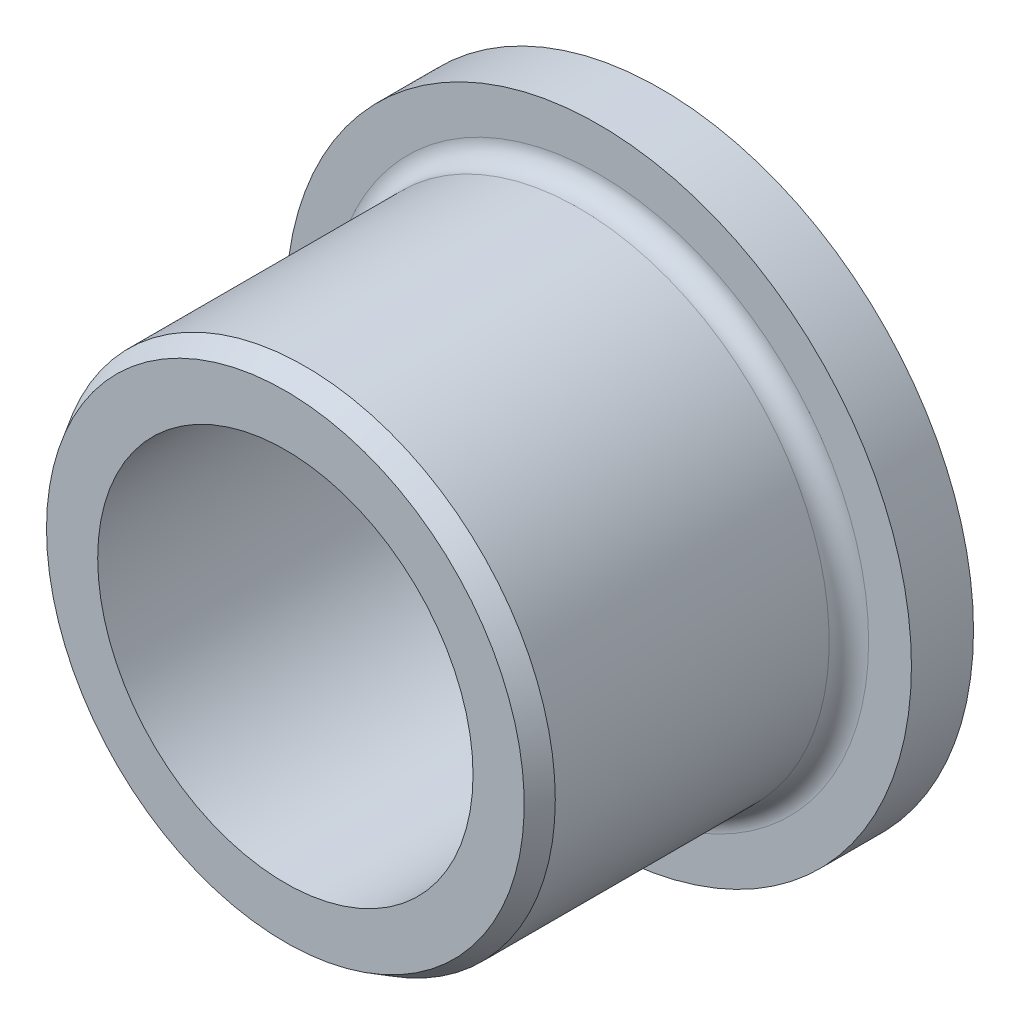
ISO-10303-21;
HEADER;
FILE_DESCRIPTION(('STEP AP214'),'2;1');
FILE_NAME('part.step','',(''),(''),'','','');
FILE_SCHEMA(('AUTOMOTIVE_DESIGN { 1 0 10303 214 1 1 1 1 }'));
ENDSEC;
DATA;
#1=APPLICATION_CONTEXT('core data for automotive mechanical design processes');
#2=APPLICATION_PROTOCOL_DEFINITION('international standard','automotive_design',2000,#1);
#3=PRODUCT_CONTEXT('',#1,'mechanical');
#4=PRODUCT('Part','Part','',(#3));
#5=PRODUCT_RELATED_PRODUCT_CATEGORY('part','',(#4));
#6=PRODUCT_DEFINITION_FORMATION('','',#4);
#7=PRODUCT_DEFINITION_CONTEXT('part definition',#1,'design');
#8=PRODUCT_DEFINITION('design','',#6,#7);
#9=PRODUCT_DEFINITION_SHAPE('','',#8);
#10=(LENGTH_UNIT() NAMED_UNIT(*) SI_UNIT(.MILLI.,.METRE.));
#11=(NAMED_UNIT(*) PLANE_ANGLE_UNIT() SI_UNIT($,.RADIAN.));
#12=(NAMED_UNIT(*) SI_UNIT($,.STERADIAN.) SOLID_ANGLE_UNIT());
#13=UNCERTAINTY_MEASURE_WITH_UNIT(LENGTH_MEASURE(1.E-05),#10,'distance_accuracy_value','');
#14=(GEOMETRIC_REPRESENTATION_CONTEXT(3) GLOBAL_UNCERTAINTY_ASSIGNED_CONTEXT((#13)) GLOBAL_UNIT_ASSIGNED_CONTEXT((#10,
#11,#12)) REPRESENTATION_CONTEXT('',''));
#15=CARTESIAN_POINT('',(0.,0.,0.));
#16=DIRECTION('',(0.,0.,1.));
#17=DIRECTION('',(1.,0.,0.));
#18=AXIS2_PLACEMENT_3D('',#15,#16,#17);
#19=CARTESIAN_POINT('',(0.,0.,2.07480000000003));
#20=DIRECTION('',(0.,0.,1.));
#21=DIRECTION('',(1.,0.,0.));
#22=AXIS2_PLACEMENT_3D('',#19,#20,#21);
#23=TOROIDAL_SURFACE('',#22,6.85000000000054,0.500000000000032);
#24=CARTESIAN_POINT('',(0.,0.,1.5748));
#25=DIRECTION('',(0.,0.,1.));
#26=DIRECTION('',(1.,0.,0.));
#27=AXIS2_PLACEMENT_3D('',#24,#25,#26);
#28=CIRCLE('',#27,6.85000000000054);
#29=CARTESIAN_POINT('',(-6.85000000000054,0.,1.5748));
#30=VERTEX_POINT('',#29);
#31=CARTESIAN_POINT('',(6.85000000000054,0.,1.5748));
#32=VERTEX_POINT('',#31);
#33=EDGE_CURVE('E38',#30,#32,#28,.F.);
#34=ORIENTED_EDGE('',*,*,#33,.F.);
#35=CARTESIAN_POINT('',(0.,0.,1.5748));
#36=DIRECTION('',(0.,0.,1.));
#37=DIRECTION('',(-1.,0.,0.));
#38=AXIS2_PLACEMENT_3D('',#35,#36,#37);
#39=CIRCLE('',#38,6.85000000000054);
#40=EDGE_CURVE('E35',#32,#30,#39,.F.);
#41=ORIENTED_EDGE('',*,*,#40,.F.);
#42=EDGE_LOOP('',(#34,#41));
#43=FACE_BOUND('',#42,.T.);
#44=CARTESIAN_POINT('',(0.,0.,2.07480000000003));
#45=DIRECTION('',(0.,0.,-1.));
#46=DIRECTION('',(-1.,0.,0.));
#47=AXIS2_PLACEMENT_3D('',#44,#45,#46);
#48=CIRCLE('',#47,6.35);
#49=CARTESIAN_POINT('',(-6.35,0.,2.07480000000003));
#50=VERTEX_POINT('',#49);
#51=EDGE_CURVE('E44',#50,#50,#48,.F.);
#52=ORIENTED_EDGE('',*,*,#51,.F.);
#53=EDGE_LOOP('',(#52));
#54=FACE_BOUND('',#53,.T.);
#55=ADVANCED_FACE('F17',(#43,#54),#23,.F.);
#56=CARTESIAN_POINT('',(7.393749999999,0.,1.5748));
#57=DIRECTION('',(0.,0.,1.));
#58=DIRECTION('',(1.,0.,0.));
#59=AXIS2_PLACEMENT_3D('',#56,#57,#58);
#60=PLANE('',#59);
#61=ORIENTED_EDGE('',*,*,#40,.T.);
#62=ORIENTED_EDGE('',*,*,#33,.T.);
#63=EDGE_LOOP('',(#61,#62));
#64=FACE_BOUND('',#63,.T.);
#65=CARTESIAN_POINT('',(0.,0.,1.5748));
#66=DIRECTION('',(0.,0.,-1.));
#67=DIRECTION('',(-1.,0.,0.));
#68=AXIS2_PLACEMENT_3D('',#65,#66,#67);
#69=CIRCLE('',#68,7.9375);
#70=CARTESIAN_POINT('',(-7.9375,0.,1.5748));
#71=VERTEX_POINT('',#70);
#72=EDGE_CURVE('E49',#71,#71,#69,.T.);
#73=ORIENTED_EDGE('',*,*,#72,.F.);
#74=EDGE_LOOP('',(#73));
#75=FACE_BOUND('',#74,.T.);
#76=ADVANCED_FACE('F40',(#64,#75),#60,.T.);
#77=CARTESIAN_POINT('',(0.,0.,5.5499));
#78=DIRECTION('',(0.,0.,-1.));
#79=DIRECTION('',(-1.,0.,0.));
#80=AXIS2_PLACEMENT_3D('',#77,#78,#79);
#81=CYLINDRICAL_SURFACE('',#80,6.35);
#82=CARTESIAN_POINT('',(0.,0.,9.02500000000828));
#83=DIRECTION('',(0.,0.,-1.));
#84=DIRECTION('',(1.,0.,0.));
#85=AXIS2_PLACEMENT_3D('',#82,#83,#84);
#86=CIRCLE('',#85,6.34999999999764);
#87=CARTESIAN_POINT('',(6.34999999999764,0.,9.02500000000828));
#88=VERTEX_POINT('',#87);
#89=EDGE_CURVE('E52',#88,#88,#86,.F.);
#90=ORIENTED_EDGE('',*,*,#89,.F.);
#91=EDGE_LOOP('',(#90));
#92=FACE_BOUND('',#91,.T.);
#93=ORIENTED_EDGE('',*,*,#51,.T.);
#94=EDGE_LOOP('',(#93));
#95=FACE_BOUND('',#94,.T.);
#96=ADVANCED_FACE('F81',(#92,#95),#81,.T.);
#97=CARTESIAN_POINT('',(0.,0.,0.7874));
#98=DIRECTION('',(0.,0.,-1.));
#99=DIRECTION('',(-1.,0.,0.));
#100=AXIS2_PLACEMENT_3D('',#97,#98,#99);
#101=CYLINDRICAL_SURFACE('',#100,7.9375);
#102=ORIENTED_EDGE('',*,*,#72,.T.);
#103=EDGE_LOOP('',(#102));
#104=FACE_BOUND('',#103,.T.);
#105=CARTESIAN_POINT('',(0.,0.,0.));
#106=DIRECTION('',(0.,0.,-1.));
#107=DIRECTION('',(-1.,0.,0.));
#108=AXIS2_PLACEMENT_3D('',#105,#106,#107);
#109=CIRCLE('',#108,7.9375);
#110=CARTESIAN_POINT('',(-7.9375,0.,0.));
#111=VERTEX_POINT('',#110);
#112=EDGE_CURVE('E53',#111,#111,#109,.T.);
#113=ORIENTED_EDGE('',*,*,#112,.F.);
#114=EDGE_LOOP('',(#113));
#115=FACE_BOUND('',#114,.T.);
#116=ADVANCED_FACE('F99',(#104,#115),#101,.T.);
#117=CARTESIAN_POINT('',(0.,0.,9.02500000017881));
#118=DIRECTION('',(0.,0.,-1.));
#119=DIRECTION('',(-1.,0.,0.));
#120=AXIS2_PLACEMENT_3D('',#117,#118,#119);
#121=CONICAL_SURFACE('',#120,6.34999999988395,0.523598775592442);
#122=CARTESIAN_POINT('',(0.,0.,9.52499999999645));
#123=DIRECTION('',(0.,0.,-1.));
#124=DIRECTION('',(-1.,0.,0.));
#125=AXIS2_PLACEMENT_3D('',#122,#123,#124);
#126=CIRCLE('',#125,6.06132486539832);
#127=CARTESIAN_POINT('',(-6.06132486539832,0.,9.52499999999645));
#128=VERTEX_POINT('',#127);
#129=EDGE_CURVE('E56',#128,#128,#126,.F.);
#130=ORIENTED_EDGE('',*,*,#129,.F.);
#131=EDGE_LOOP('',(#130));
#132=FACE_BOUND('',#131,.T.);
#133=ORIENTED_EDGE('',*,*,#89,.T.);
#134=EDGE_LOOP('',(#133));
#135=FACE_BOUND('',#134,.T.);
#136=ADVANCED_FACE('F95',(#132,#135),#121,.T.);
#137=CARTESIAN_POINT('',(6.35,0.,0.));
#138=DIRECTION('',(0.,0.,-1.));
#139=DIRECTION('',(-1.,0.,0.));
#140=AXIS2_PLACEMENT_3D('',#137,#138,#139);
#141=PLANE('',#140);
#142=CARTESIAN_POINT('',(0.,0.,0.));
#143=DIRECTION('',(0.,0.,-1.));
#144=DIRECTION('',(-1.,0.,0.));
#145=AXIS2_PLACEMENT_3D('',#142,#143,#144);
#146=CIRCLE('',#145,4.7625);
#147=CARTESIAN_POINT('',(-4.7625,0.,0.));
#148=VERTEX_POINT('',#147);
#149=EDGE_CURVE('E28',#148,#148,#146,.F.);
#150=ORIENTED_EDGE('',*,*,#149,.T.);
#151=EDGE_LOOP('',(#150));
#152=FACE_BOUND('',#151,.T.);
#153=ORIENTED_EDGE('',*,*,#112,.T.);
#154=EDGE_LOOP('',(#153));
#155=FACE_BOUND('',#154,.T.);
#156=ADVANCED_FACE('F113',(#152,#155),#141,.T.);
#157=CARTESIAN_POINT('',(5.41191243270162,0.,9.525));
#158=DIRECTION('',(0.,0.,1.));
#159=DIRECTION('',(1.,0.,0.));
#160=AXIS2_PLACEMENT_3D('',#157,#158,#159);
#161=PLANE('',#160);
#162=CARTESIAN_POINT('',(0.,0.,9.525));
#163=DIRECTION('',(0.,0.,-1.));
#164=DIRECTION('',(-1.,0.,0.));
#165=AXIS2_PLACEMENT_3D('',#162,#163,#164);
#166=CIRCLE('',#165,4.7625);
#167=CARTESIAN_POINT('',(-4.7625,0.,9.525));
#168=VERTEX_POINT('',#167);
#169=EDGE_CURVE('E11',#168,#168,#166,.T.);
#170=ORIENTED_EDGE('',*,*,#169,.T.);
#171=EDGE_LOOP('',(#170));
#172=FACE_BOUND('',#171,.T.);
#173=ORIENTED_EDGE('',*,*,#129,.T.);
#174=EDGE_LOOP('',(#173));
#175=FACE_BOUND('',#174,.T.);
#176=ADVANCED_FACE('F107',(#172,#175),#161,.T.);
#177=CARTESIAN_POINT('',(0.,0.,4.7625));
#178=DIRECTION('',(0.,0.,-1.));
#179=DIRECTION('',(-1.,0.,0.));
#180=AXIS2_PLACEMENT_3D('',#177,#178,#179);
#181=CYLINDRICAL_SURFACE('',#180,4.7625);
#182=ORIENTED_EDGE('',*,*,#149,.F.);
#183=EDGE_LOOP('',(#182));
#184=FACE_BOUND('',#183,.T.);
#185=ORIENTED_EDGE('',*,*,#169,.F.);
#186=EDGE_LOOP('',(#185));
#187=FACE_BOUND('',#186,.T.);
#188=ADVANCED_FACE('F105',(#184,#187),#181,.F.);
#189=CLOSED_SHELL('',(#55,#76,#96,#116,#136,#156,#176,#188));
#190=MANIFOLD_SOLID_BREP('B1',#189);
#191=ADVANCED_BREP_SHAPE_REPRESENTATION('',(#18,#190),#14);
#192=SHAPE_DEFINITION_REPRESENTATION(#9,#191);
ENDSEC;
END-ISO-10303-21;
